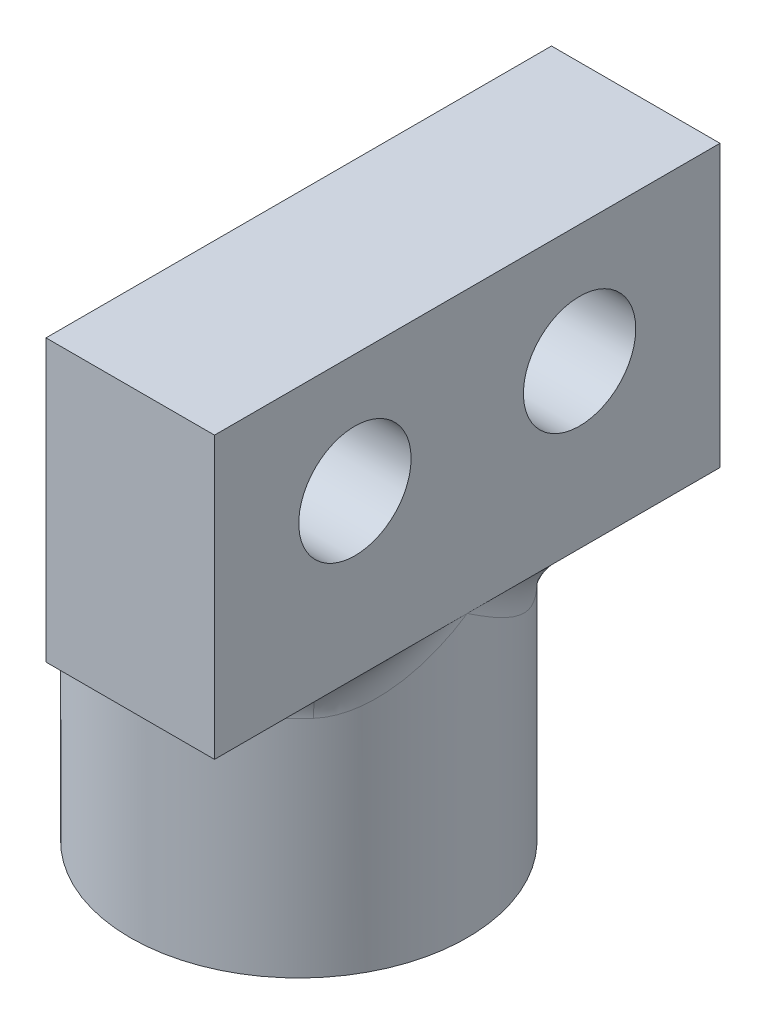
ISO-10303-21;
HEADER;
FILE_DESCRIPTION(('STEP AP214'),'2;1');
FILE_NAME('part.step','',(''),(''),'','','');
FILE_SCHEMA(('AUTOMOTIVE_DESIGN { 1 0 10303 214 1 1 1 1 }'));
ENDSEC;
DATA;
#1=APPLICATION_CONTEXT('core data for automotive mechanical design processes');
#2=APPLICATION_PROTOCOL_DEFINITION('international standard','automotive_design',2000,#1);
#3=PRODUCT_CONTEXT('',#1,'mechanical');
#4=PRODUCT('Part','Part','',(#3));
#5=PRODUCT_RELATED_PRODUCT_CATEGORY('part','',(#4));
#6=PRODUCT_DEFINITION_FORMATION('','',#4);
#7=PRODUCT_DEFINITION_CONTEXT('part definition',#1,'design');
#8=PRODUCT_DEFINITION('design','',#6,#7);
#9=PRODUCT_DEFINITION_SHAPE('','',#8);
#10=(LENGTH_UNIT() NAMED_UNIT(*) SI_UNIT(.MILLI.,.METRE.));
#11=(NAMED_UNIT(*) PLANE_ANGLE_UNIT() SI_UNIT($,.RADIAN.));
#12=(NAMED_UNIT(*) SI_UNIT($,.STERADIAN.) SOLID_ANGLE_UNIT());
#13=UNCERTAINTY_MEASURE_WITH_UNIT(LENGTH_MEASURE(1.E-05),#10,'distance_accuracy_value','');
#14=(GEOMETRIC_REPRESENTATION_CONTEXT(3) GLOBAL_UNCERTAINTY_ASSIGNED_CONTEXT((#13)) GLOBAL_UNIT_ASSIGNED_CONTEXT((#10,
#11,#12)) REPRESENTATION_CONTEXT('',''));
#15=CARTESIAN_POINT('',(0.,0.,0.));
#16=DIRECTION('',(0.,0.,1.));
#17=DIRECTION('',(1.,0.,0.));
#18=AXIS2_PLACEMENT_3D('',#15,#16,#17);
#19=CARTESIAN_POINT('',(0.,10.,0.));
#20=DIRECTION('',(0.,-1.,0.));
#21=DIRECTION('',(0.,0.,-1.));
#22=AXIS2_PLACEMENT_3D('',#19,#20,#21);
#23=CYLINDRICAL_SURFACE('',#22,4.);
#24=CARTESIAN_POINT('',(0.,0.,0.));
#25=DIRECTION('',(0.,1.,0.));
#26=DIRECTION('',(0.,0.,1.));
#27=AXIS2_PLACEMENT_3D('',#24,#25,#26);
#28=CIRCLE('',#27,4.);
#29=CARTESIAN_POINT('',(0.,0.,4.));
#30=VERTEX_POINT('',#29);
#31=EDGE_CURVE('E146',#30,#30,#28,.T.);
#32=ORIENTED_EDGE('',*,*,#31,.F.);
#33=EDGE_LOOP('',(#32));
#34=FACE_BOUND('',#33,.T.);
#35=CARTESIAN_POINT('',(0.,7.,0.));
#36=DIRECTION('',(0.,1.,0.));
#37=DIRECTION('',(0.,0.,1.));
#38=AXIS2_PLACEMENT_3D('',#35,#36,#37);
#39=CIRCLE('',#38,4.);
#40=CARTESIAN_POINT('',(0.,7.,4.));
#41=VERTEX_POINT('',#40);
#42=EDGE_CURVE('E231',#41,#41,#39,.T.);
#43=ORIENTED_EDGE('',*,*,#42,.T.);
#44=EDGE_LOOP('',(#43));
#45=FACE_BOUND('',#44,.T.);
#46=ADVANCED_FACE('F37',(#34,#45),#23,.F.);
#47=CARTESIAN_POINT('',(0.,10.,0.));
#48=DIRECTION('',(0.,1.,0.));
#49=DIRECTION('',(0.,0.,1.));
#50=AXIS2_PLACEMENT_3D('',#47,#48,#49);
#51=PLANE('',#50);
#52=CARTESIAN_POINT('',(0.,10.,0.));
#53=DIRECTION('',(0.,1.,0.));
#54=DIRECTION('',(0.,0.,1.));
#55=AXIS2_PLACEMENT_3D('',#52,#53,#54);
#56=CIRCLE('',#55,6.);
#57=CARTESIAN_POINT('',(-1.,10.,-5.91607978309962));
#58=VERTEX_POINT('',#57);
#59=CARTESIAN_POINT('',(-1.,10.,5.91607978309962));
#60=VERTEX_POINT('',#59);
#61=EDGE_CURVE('E155',#58,#60,#56,.T.);
#62=ORIENTED_EDGE('',*,*,#61,.T.);
#63=DIRECTION('',(0.,0.,-1.));
#64=VECTOR('',#63,1.);
#65=CARTESIAN_POINT('',(-1.,10.,-6.));
#66=LINE('',#65,#64);
#67=EDGE_CURVE('E278',#60,#58,#66,.T.);
#68=ORIENTED_EDGE('',*,*,#67,.T.);
#69=EDGE_LOOP('',(#62,#68));
#70=FACE_BOUND('',#69,.T.);
#71=ADVANCED_FACE('F324',(#70),#51,.T.);
#72=CARTESIAN_POINT('',(0.,0.,0.));
#73=DIRECTION('',(0.,1.,0.));
#74=DIRECTION('',(0.,0.,1.));
#75=AXIS2_PLACEMENT_3D('',#72,#73,#74);
#76=PLANE('',#75);
#77=CARTESIAN_POINT('',(0.,0.,0.));
#78=DIRECTION('',(0.,1.,0.));
#79=DIRECTION('',(0.,0.,1.));
#80=AXIS2_PLACEMENT_3D('',#77,#78,#79);
#81=CIRCLE('',#80,6.);
#82=CARTESIAN_POINT('',(0.,0.,6.));
#83=VERTEX_POINT('',#82);
#84=EDGE_CURVE('E149',#83,#83,#81,.T.);
#85=ORIENTED_EDGE('',*,*,#84,.F.);
#86=EDGE_LOOP('',(#85));
#87=FACE_BOUND('',#86,.T.);
#88=ORIENTED_EDGE('',*,*,#31,.T.);
#89=EDGE_LOOP('',(#88));
#90=FACE_BOUND('',#89,.T.);
#91=ADVANCED_FACE('F187',(#87,#90),#76,.F.);
#92=CARTESIAN_POINT('',(0.,10.,0.));
#93=DIRECTION('',(0.,-1.,0.));
#94=DIRECTION('',(0.,0.,-1.));
#95=AXIS2_PLACEMENT_3D('',#92,#93,#94);
#96=CYLINDRICAL_SURFACE('',#95,6.);
#97=ORIENTED_EDGE('',*,*,#61,.F.);
#98=CARTESIAN_POINT('',(-1.,10.,-5.91607978309962));
#99=CARTESIAN_POINT('',(-0.972295685701405,10.0000001747414,-5.92076372818397));
#100=CARTESIAN_POINT('',(-0.944570209980479,10.0011521080634,-5.92524870131366));
#101=CARTESIAN_POINT('',(-0.889246515655249,10.0057640704647,-5.93380337786455));
#102=CARTESIAN_POINT('',(-0.861648302356349,10.0092241949091,-5.93787306411977));
#103=CARTESIAN_POINT('',(-0.779382785868549,10.0230600602079,-5.94942135947803));
#104=CARTESIAN_POINT('',(-0.725162463681373,10.036891276915,-5.95625302477123));
#105=CARTESIAN_POINT('',(-0.619594288141451,10.0734906939978,-5.96816013882162));
#106=CARTESIAN_POINT('',(-0.568249114498119,10.0962670781436,-5.97323397134652));
#107=CARTESIAN_POINT('',(-0.470001447300006,10.1501542895213,-5.98176648013792));
#108=CARTESIAN_POINT('',(-0.423097543931658,10.1812624598685,-5.9852256703274));
#109=CARTESIAN_POINT('',(-0.33543960373115,10.2506909420177,-5.99077622626737));
#110=CARTESIAN_POINT('',(-0.294643628615312,10.2889575867555,-5.99287728287855));
#111=CARTESIAN_POINT('',(-0.219966264969299,10.3717828298557,-5.99608333344492));
#112=CARTESIAN_POINT('',(-0.186086604709587,10.4163429961682,-5.99718807867384));
#113=CARTESIAN_POINT('',(-0.126123868965448,10.5106395037474,-5.99874976095427));
#114=CARTESIAN_POINT('',(-0.100066342528996,10.5603921068612,-5.99920459302881));
#115=CARTESIAN_POINT('',(-0.0566416255269108,10.6635444366849,-5.99977213876146));
#116=CARTESIAN_POINT('',(-0.0392699367541451,10.7169422592958,-5.99988502965703));
#117=CARTESIAN_POINT('',(-0.0176857584929651,10.8088414953916,-5.99998044190027));
#118=CARTESIAN_POINT('',(-0.0110587993800629,10.8467939872846,-5.99999264488213));
#119=CARTESIAN_POINT('',(-0.00221563612105374,10.9231592194416,-6.00000001457346));
#120=CARTESIAN_POINT('',(6.29037270521335E-06,10.9615712972982,-5.99999520340778));
#121=CARTESIAN_POINT('',(0.,11.,-6.));
#122=B_SPLINE_CURVE_WITH_KNOTS('',3,(#98,#99,#100,#101,#102,#103,#104,#105,#106,#107,#108,#109,
#110,#111,#112,#113,#114,#115,#116,#117,#118,#119,#120,#121),.UNSPECIFIED.,.F.,.F.,(4,2,2,2,2,2,
2,2,2,2,2,4),(0.,0.0842429978800039,0.16848947655248,0.336735693421336,0.505136195593484,
0.673483061116316,0.840615038340064,1.00778872804346,1.1755026518886,1.34312963013154,
1.45846933488263,1.5736591094174),.UNSPECIFIED.);
#123=CARTESIAN_POINT('',(0.,11.,-6.));
#124=VERTEX_POINT('',#123);
#125=EDGE_CURVE('E47',#58,#124,#122,.T.);
#126=ORIENTED_EDGE('',*,*,#125,.T.);
#127=DIRECTION('',(0.,-1.,0.));
#128=VECTOR('',#127,1.);
#129=CARTESIAN_POINT('',(0.,10.,-6.));
#130=LINE('',#129,#128);
#131=CARTESIAN_POINT('',(0.,8.,-6.));
#132=VERTEX_POINT('',#131);
#133=EDGE_CURVE('E55',#124,#132,#130,.T.);
#134=ORIENTED_EDGE('',*,*,#133,.T.);
#135=CARTESIAN_POINT('',(0.,8.,0.));
#136=DIRECTION('',(0.,1.,0.));
#137=DIRECTION('',(0.,0.,1.));
#138=AXIS2_PLACEMENT_3D('',#135,#136,#137);
#139=CIRCLE('',#138,6.);
#140=CARTESIAN_POINT('',(4.5,8.,-3.96862696659689));
#141=VERTEX_POINT('',#140);
#142=EDGE_CURVE('E274',#132,#141,#139,.F.);
#143=ORIENTED_EDGE('',*,*,#142,.T.);
#144=CARTESIAN_POINT('',(3.8881741324276,8.1739324058906,-4.56969385363187));
#145=CARTESIAN_POINT('',(4.53137954969786,10.6560837682309,-4.02241547014019));
#146=CARTESIAN_POINT('',(6.,10.,-6.09292513817582));
#147=CARTESIAN_POINT('',(3.93526279049348,8.14589332069388,-4.52964079914924));
#148=CARTESIAN_POINT('',(4.50293319784637,10.6088499220202,-4.03529777543976));
#149=CARTESIAN_POINT('',(6.,10.,-6.0395210655389));
#150=CARTESIAN_POINT('',(3.9824101299893,8.12168251324196,-4.48825723590215));
#151=CARTESIAN_POINT('',(4.48121743740939,10.5586274207049,-4.04464880001376));
#152=CARTESIAN_POINT('',(6.,10.,-5.98434298121036));
#153=CARTESIAN_POINT('',(4.07624021718959,8.08033888259881,-4.40320803649471));
#154=CARTESIAN_POINT('',(4.45084982766612,10.4565617555743,-4.05540477376931));
#155=CARTESIAN_POINT('',(6.,10.,-5.87094404866471));
#156=CARTESIAN_POINT('',(4.12292364060194,8.06319358164838,-4.35954657813812));
#157=CARTESIAN_POINT('',(4.44188962597711,10.4048045270733,-4.05700075307973));
#158=CARTESIAN_POINT('',(6.,10.,-5.81272877085263));
#159=CARTESIAN_POINT('',(4.26070395863014,8.0216524084973,-4.22641488674984));
#160=CARTESIAN_POINT('',(4.4322656458812,10.2541454503889,-4.04984181529547));
#161=CARTESIAN_POINT('',(6.,10.,-5.6352198489962));
#162=CARTESIAN_POINT('',(4.35052291834169,8.00659961985399,-4.1339578129278));
#163=CARTESIAN_POINT('',(4.44662522066588,10.155274627041,-4.03031422433822));
#164=CARTESIAN_POINT('',(6.,10.,-5.51194375056902));
#165=CARTESIAN_POINT('',(4.5639049110967,7.99466967262371,-3.89950006231645));
#166=CARTESIAN_POINT('',(4.51755070316198,9.93712657404065,-3.94773896778231));
#167=CARTESIAN_POINT('',(6.,10.,-5.19933341642394));
#168=CARTESIAN_POINT('',(4.68409952624939,8.00926290050841,-3.75418985202283));
#169=CARTESIAN_POINT('',(4.58834624431363,9.82393029766119,-3.87068436475619));
#170=CARTESIAN_POINT('',(6.,10.,-5.00558646936602));
#171=CARTESIAN_POINT('',(4.90920863029963,8.06974267671834,-3.45472418962107));
#172=CARTESIAN_POINT('',(4.75389126884018,9.64567469576468,-3.67175567550996));
#173=CARTESIAN_POINT('',(6.,10.,-4.60629891949251));
#174=CARTESIAN_POINT('',(5.01402699051333,8.1158166846134,-3.30052084588875));
#175=CARTESIAN_POINT('',(4.84797666678286,9.57787138352697,-3.55142984401783));
#176=CARTESIAN_POINT('',(6.,10.,-4.400694461178));
#177=CARTESIAN_POINT('',(5.18467181766214,8.21721867742286,-3.02311379553071));
#178=CARTESIAN_POINT('',(5.01588274789588,9.49417298513019,-3.31155428787133));
#179=CARTESIAN_POINT('',(6.,10.,-4.03081839404632));
#180=CARTESIAN_POINT('',(5.25390663476926,8.26793252542353,-2.90100125326329));
#181=CARTESIAN_POINT('',(5.08895909271457,9.46911888364102,-3.19949052276703));
#182=CARTESIAN_POINT('',(6.,10.,-3.86800167103543));
#183=CARTESIAN_POINT('',(5.38272131376337,8.37973522821349,-2.65436965159966));
#184=CARTESIAN_POINT('',(5.23033235010697,9.43865198178121,-2.96296529866294));
#185=CARTESIAN_POINT('',(6.,10.,-3.53915953548441));
#186=CARTESIAN_POINT('',(5.44229764357389,8.44082786183934,-2.52984973038109));
#187=CARTESIAN_POINT('',(5.29903513805874,9.43262251721526,-2.8384046710416));
#188=CARTESIAN_POINT('',(6.,10.,-3.3731329738478));
#189=CARTESIAN_POINT('',(5.60686792650618,8.63605363037383,-2.15359667028571));
#190=CARTESIAN_POINT('',(5.49059794596169,9.43799544623112,-2.45601357152588));
#191=CARTESIAN_POINT('',(6.,10.,-2.87146222703491));
#192=CARTESIAN_POINT('',(5.69774526915183,8.78216268317035,-1.89910069151801));
#193=CARTESIAN_POINT('',(5.60620492387143,9.4708889782354,-2.1783557115166));
#194=CARTESIAN_POINT('',(6.,10.,-2.53213425535389));
#195=CARTESIAN_POINT('',(5.8473807588486,9.10023601796244,-1.37355257644114));
#196=CARTESIAN_POINT('',(5.79687944872776,9.57575225163142,-1.59397739451812));
#197=CARTESIAN_POINT('',(6.,10.,-1.83140343525849));
#198=CARTESIAN_POINT('',(5.90428472504987,9.27313348230999,-1.10231347151144));
#199=CARTESIAN_POINT('',(5.87285110918309,9.64928669055712,-1.28181943176351));
#200=CARTESIAN_POINT('',(6.,10.,-1.46975129534949));
#201=CARTESIAN_POINT('',(5.98030661422106,9.62807296341012,-0.557954224252146));
#202=CARTESIAN_POINT('',(5.97322691829025,9.81343349237779,-0.65341591032027));
#203=CARTESIAN_POINT('',(6.,10.,-0.743938965668618));
#204=CARTESIAN_POINT('',(5.99944262915574,9.8101105588937,-0.284835045485269));
#205=CARTESIAN_POINT('',(5.99925080771343,9.90504661042241,-0.332343061915692));
#206=CARTESIAN_POINT('',(6.,10.,-0.379780060647023));
#207=CARTESIAN_POINT('',(5.99999599572093,9.99466670941827,-0.00799993980455591));
#208=CARTESIAN_POINT('',(5.99999474816089,9.99733334824275,-0.00933327087008581));
#209=CARTESIAN_POINT('',(6.,10.,-0.010666586406075));
#210=CARTESIAN_POINT('',(5.9999999954381,9.99733337812888,-0.00399993733404565));
#211=CARTESIAN_POINT('',(6.00000008372391,9.99866668474011,-0.00466659350034427));
#212=CARTESIAN_POINT('',(6.,10.,-0.00533324977872788));
#213=CARTESIAN_POINT('',(6.,10.,0.));
#214=CARTESIAN_POINT('',(6.,10.,0.));
#215=CARTESIAN_POINT('',(6.,10.,0.));
#216=(BOUNDED_SURFACE() B_SPLINE_SURFACE(3,2,((#144,#145,#146),(#147,#148,#149),(#150,#151,
#152),(#153,#154,#155),(#156,#157,#158),(#159,#160,#161),(#162,#163,#164),(#165,#166,#167),
(#168,#169,#170),(#171,#172,#173),(#174,#175,#176),(#177,#178,#179),(#180,#181,#182),(#183,#184,
#185),(#186,#187,#188),(#189,#190,#191),(#192,#193,#194),(#195,#196,#197),(#198,#199,#200),
(#201,#202,#203),(#204,#205,#206),(#207,#208,#209),(#210,#211,#212),(#213,#214,#215)),
.UNSPECIFIED.,.F.,.F.,.F.) B_SPLINE_SURFACE_WITH_KNOTS((4,2,2,2,2,2,2,2,2,2,2,4),(3,3),(0.,
0.26095127997421,0.521439721635325,1.03703177445814,1.78857808075952,2.5446390990503,
3.12560695240519,3.70678678683636,4.86881450148977,6.08953591362392,7.30967242206215,
7.32756097306819),(0.,1.),
.UNSPECIFIED.) GEOMETRIC_REPRESENTATION_ITEM() RATIONAL_B_SPLINE_SURFACE(((1.,0.606497892647934,
1.),(1.,0.61356239369123,1.),(1.,0.62082000262735,1.),(1.,0.635585634771414,1.),(1.,
0.643093190998653,1.),(1.,0.665670024822543,1.),(1.,0.680944336214346,1.),(1.,0.718190766945489,
1.),(1.,0.74002912360749,1.),(1.,0.781881004562588,1.),(1.,0.801882778589946,1.),(1.,
0.83493307659474,1.),(1.,0.84851913923067,1.),(1.,0.874014565928818,1.),(1.,0.88592331639563,
1.),(1.,0.91901863083676,1.),(1.,0.937582558643049,1.),(1.,0.968311867041381,1.),(1.,
0.980106697900777,1.),(1.,0.99589078916237,1.),(1.,0.999883786864014,1.),(1.,0.999999167156847,
1.),(1.,1.00000000047256,1.),(1.,1.,1.))) REPRESENTATION_ITEM('') SURFACE());
#217=CARTESIAN_POINT('',(3.8881741324276,8.1739324058906,-4.56969385363187));
#218=CARTESIAN_POINT('',(3.93526279049348,8.14589332069388,-4.52964079914924));
#219=CARTESIAN_POINT('',(3.9824101299893,8.12168251324196,-4.48825723590215));
#220=CARTESIAN_POINT('',(4.07624021718959,8.08033888259881,-4.40320803649471));
#221=CARTESIAN_POINT('',(4.12292364060194,8.06319358164838,-4.35954657813812));
#222=CARTESIAN_POINT('',(4.26070395863014,8.0216524084973,-4.22641488674984));
#223=CARTESIAN_POINT('',(4.35052291834169,8.00659961985399,-4.1339578129278));
#224=CARTESIAN_POINT('',(4.56390491109669,7.99466967262371,-3.89950006231645));
#225=CARTESIAN_POINT('',(4.68409952624939,8.00926290050841,-3.75418985202283));
#226=CARTESIAN_POINT('',(4.90920863029964,8.06974267671834,-3.45472418962107));
#227=CARTESIAN_POINT('',(5.01402699051333,8.1158166846134,-3.30052084588875));
#228=CARTESIAN_POINT('',(5.18467181766214,8.21721867742286,-3.02311379553071));
#229=CARTESIAN_POINT('',(5.25390663476926,8.26793252542353,-2.90100125326329));
#230=CARTESIAN_POINT('',(5.38272131376337,8.3797352282135,-2.65436965159966));
#231=CARTESIAN_POINT('',(5.44229764357389,8.44082786183934,-2.52984973038109));
#232=CARTESIAN_POINT('',(5.60686792650618,8.63605363037383,-2.15359667028571));
#233=CARTESIAN_POINT('',(5.69774526915183,8.78216268317035,-1.89910069151801));
#234=CARTESIAN_POINT('',(5.8473807588486,9.10023601796244,-1.37355257644114));
#235=CARTESIAN_POINT('',(5.90428472504987,9.27313348230998,-1.10231347151144));
#236=CARTESIAN_POINT('',(5.98030661422106,9.62807296341012,-0.557954224252145));
#237=CARTESIAN_POINT('',(5.99944262915573,9.81011055889371,-0.284835045485267));
#238=CARTESIAN_POINT('',(5.99999599572093,9.99466670941827,-0.0079999398045559));
#239=CARTESIAN_POINT('',(5.9999999954381,9.99733337812888,-0.00399993733404564));
#240=CARTESIAN_POINT('',(6.,10.,0.));
#241=B_SPLINE_CURVE_WITH_KNOTS('',3,(#217,#218,#219,#220,#221,#222,#223,#224,#225,#226,#227,
#228,#229,#230,#231,#232,#233,#234,#235,#236,#237,#238,#239,#240),.UNSPECIFIED.,.F.,.F.,(4,2,2,
2,2,2,2,2,2,2,2,4),(0.,0.26095127997421,0.521439721635325,1.03703177445814,1.78857808075952,
2.5446390990503,3.12560695240519,3.70678678683636,4.86881450148977,6.08953591362392,
7.30967242206215,7.32756097306819),.UNSPECIFIED.);
#242=CARTESIAN_POINT('',(6.,10.,0.));
#243=VERTEX_POINT('',#242);
#244=EDGE_CURVE('E173',#141,#243,#241,.T.);
#245=ORIENTED_EDGE('',*,*,#244,.T.);
#246=CARTESIAN_POINT('',(6.,10.,6.09292513817593));
#247=CARTESIAN_POINT('',(4.53137954969792,10.656083768231,4.02241547014016));
#248=CARTESIAN_POINT('',(3.88817413242751,8.17393240589066,4.56969385363195));
#249=CARTESIAN_POINT('',(6.,10.,6.03952106553902));
#250=CARTESIAN_POINT('',(4.50293319784642,10.6088499220203,4.03529777543974));
#251=CARTESIAN_POINT('',(3.93526279049338,8.14589332069393,4.52964079914932));
#252=CARTESIAN_POINT('',(6.,10.,5.98434298121048));
#253=CARTESIAN_POINT('',(4.48121743740943,10.558627420705,4.04464880001374));
#254=CARTESIAN_POINT('',(3.9824101299892,8.12168251324201,4.48825723590224));
#255=CARTESIAN_POINT('',(6.,10.,5.87094404866483));
#256=CARTESIAN_POINT('',(4.45084982766614,10.4565617555745,4.05540477376931));
#257=CARTESIAN_POINT('',(4.07624021718949,8.08033888259885,4.4032080364948));
#258=CARTESIAN_POINT('',(6.,10.,5.81272877085276));
#259=CARTESIAN_POINT('',(4.44188962597712,10.4048045270734,4.05700075307973));
#260=CARTESIAN_POINT('',(4.12292364060184,8.06319358164841,4.35954657813821));
#261=CARTESIAN_POINT('',(6.,10.,5.63521984899635));
#262=CARTESIAN_POINT('',(4.43226564588119,10.2541454503891,4.04984181529549));
#263=CARTESIAN_POINT('',(4.26070395863002,8.02165240849732,4.22641488674995));
#264=CARTESIAN_POINT('',(6.,10.,5.51194375056919));
#265=CARTESIAN_POINT('',(4.44662522066586,10.1552746270411,4.03031422433825));
#266=CARTESIAN_POINT('',(4.35052291834157,8.00659961985401,4.13395781292792));
#267=CARTESIAN_POINT('',(6.,10.,5.19933341642414));
#268=CARTESIAN_POINT('',(4.51755070316191,9.93712657404078,3.94773896778238));
#269=CARTESIAN_POINT('',(4.56390491109656,7.99466967262371,3.8995000623166));
#270=CARTESIAN_POINT('',(6.,10.,5.00558646936625));
#271=CARTESIAN_POINT('',(4.58834624431354,9.82393029766132,3.87068436475629));
#272=CARTESIAN_POINT('',(4.68409952624925,8.00926290050838,3.75418985202301));
#273=CARTESIAN_POINT('',(6.,10.,4.60629891949278));
#274=CARTESIAN_POINT('',(4.75389126884006,9.64567469576478,3.67175567551012));
#275=CARTESIAN_POINT('',(4.90920863029949,8.06974267671829,3.45472418962128));
#276=CARTESIAN_POINT('',(6.,10.,4.40069446117829));
#277=CARTESIAN_POINT('',(4.84797666678273,9.57787138352706,3.55142984401801));
#278=CARTESIAN_POINT('',(5.01402699051319,8.11581668461333,3.30052084588897));
#279=CARTESIAN_POINT('',(6.,10.,4.03081839404665));
#280=CARTESIAN_POINT('',(5.01588274789573,9.49417298513024,3.31155428787155));
#281=CARTESIAN_POINT('',(5.184671817662,8.21721867742276,3.02311379553095));
#282=CARTESIAN_POINT('',(6.,10.,3.86800167103577));
#283=CARTESIAN_POINT('',(5.08895909271442,9.46911888364106,3.19949052276727));
#284=CARTESIAN_POINT('',(5.25390663476912,8.26793252542342,2.90100125326355));
#285=CARTESIAN_POINT('',(6.,10.,3.53915953548477));
#286=CARTESIAN_POINT('',(5.23033235010682,9.43865198178123,2.9629652986632));
#287=CARTESIAN_POINT('',(5.38272131376324,8.37973522821336,2.65436965159993));
#288=CARTESIAN_POINT('',(6.,10.,3.37313297384817));
#289=CARTESIAN_POINT('',(5.29903513805859,9.43262251721526,2.83840467104188));
#290=CARTESIAN_POINT('',(5.44229764357376,8.44082786183919,2.52984973038136));
#291=CARTESIAN_POINT('',(6.,10.,2.87146222703534));
#292=CARTESIAN_POINT('',(5.49059794596154,9.4379954462311,2.45601357152622));
#293=CARTESIAN_POINT('',(5.60686792650605,8.63605363037368,2.15359667028603));
#294=CARTESIAN_POINT('',(6.,10.,2.5321342553544));
#295=CARTESIAN_POINT('',(5.60620492387128,9.47088897823539,2.17835571151702));
#296=CARTESIAN_POINT('',(5.69774526915172,8.78216268317025,1.8991006915184));
#297=CARTESIAN_POINT('',(6.,10.,1.83140343525887));
#298=CARTESIAN_POINT('',(5.79687944872767,9.57575225163129,1.59397739451844));
#299=CARTESIAN_POINT('',(5.84738075884853,9.10023601796214,1.37355257644142));
#300=CARTESIAN_POINT('',(6.,10.,1.46975129534964));
#301=CARTESIAN_POINT('',(5.87285110918304,9.64928669055686,1.28181943176364));
#302=CARTESIAN_POINT('',(5.90428472504982,9.27313348230943,1.10231347151155));
#303=CARTESIAN_POINT('',(6.,10.,0.743938965668995));
#304=CARTESIAN_POINT('',(5.97322691829023,9.81343349237794,0.653415910320603));
#305=CARTESIAN_POINT('',(5.98030661422105,9.62807296341042,0.55795422425243));
#306=CARTESIAN_POINT('',(6.,10.,0.37978006064785));
#307=CARTESIAN_POINT('',(5.99925080771341,9.90504661042309,0.332343061916416));
#308=CARTESIAN_POINT('',(5.99944262915574,9.8101105588951,0.284835045485892));
#309=CARTESIAN_POINT('',(6.,10.,0.010666586406095));
#310=CARTESIAN_POINT('',(5.99999474816089,9.99733334824277,0.00933327087010328));
#311=CARTESIAN_POINT('',(5.99999599572093,9.99466670941831,0.00799993980457092));
#312=CARTESIAN_POINT('',(6.,10.,0.00533324977873798));
#313=CARTESIAN_POINT('',(6.00000008372391,9.99866668474012,0.00466659350035312));
#314=CARTESIAN_POINT('',(5.9999999954381,9.99733337812891,0.00399993733405325));
#315=CARTESIAN_POINT('',(6.,10.,0.));
#316=CARTESIAN_POINT('',(6.,10.,0.));
#317=CARTESIAN_POINT('',(6.,10.,0.));
#318=(BOUNDED_SURFACE() B_SPLINE_SURFACE(3,2,((#246,#247,#248),(#249,#250,#251),(#252,#253,
#254),(#255,#256,#257),(#258,#259,#260),(#261,#262,#263),(#264,#265,#266),(#267,#268,#269),
(#270,#271,#272),(#273,#274,#275),(#276,#277,#278),(#279,#280,#281),(#282,#283,#284),(#285,#286,
#287),(#288,#289,#290),(#291,#292,#293),(#294,#295,#296),(#297,#298,#299),(#300,#301,#302),
(#303,#304,#305),(#306,#307,#308),(#309,#310,#311),(#312,#313,#314),(#315,#316,#317)),
.UNSPECIFIED.,.F.,.F.,.F.) B_SPLINE_SURFACE_WITH_KNOTS((4,2,2,2,2,2,2,2,2,2,2,4),(3,3),(0.,
0.260951279974199,0.521439721635305,1.03703177445807,1.78857808075937,2.5446390990501,
3.12560695240495,3.7067867868361,4.86881450148938,6.08953591362379,7.30967242206233,
7.32756097306836),(0.,1.),
.UNSPECIFIED.) GEOMETRIC_REPRESENTATION_ITEM() RATIONAL_B_SPLINE_SURFACE(((1.,0.606497892647919,
1.),(1.,0.613562393691215,1.),(1.,0.620820002627334,1.),(1.,0.635585634771398,1.),(1.,
0.643093190998636,1.),(1.,0.665670024822524,1.),(1.,0.680944336214326,1.),(1.,0.718190766945465,
1.),(1.,0.740029123607464,1.),(1.,0.78188100456256,1.),(1.,0.801882778589918,1.),(1.,
0.834933076594713,1.),(1.,0.848519139230642,1.),(1.,0.874014565928791,1.),(1.,0.885923316395604,
1.),(1.,0.919018630836735,1.),(1.,0.937582558643025,1.),(1.,0.968311867041365,1.),(1.,
0.980106697900766,1.),(1.,0.995890789162369,1.),(1.,0.999883786864016,1.),(1.,0.999999167156847,
1.),(1.,1.00000000047256,1.),(1.,1.,1.))) REPRESENTATION_ITEM('') SURFACE());
#319=CARTESIAN_POINT('',(3.88817413242751,8.17393240589066,4.56969385363195));
#320=CARTESIAN_POINT('',(3.93526279049338,8.14589332069393,4.52964079914932));
#321=CARTESIAN_POINT('',(3.9824101299892,8.12168251324201,4.48825723590224));
#322=CARTESIAN_POINT('',(4.07624021718949,8.08033888259885,4.4032080364948));
#323=CARTESIAN_POINT('',(4.12292364060184,8.06319358164841,4.35954657813821));
#324=CARTESIAN_POINT('',(4.26070395863002,8.02165240849732,4.22641488674995));
#325=CARTESIAN_POINT('',(4.35052291834157,8.00659961985401,4.13395781292792));
#326=CARTESIAN_POINT('',(4.56390491109656,7.99466967262371,3.8995000623166));
#327=CARTESIAN_POINT('',(4.68409952624925,8.00926290050838,3.75418985202301));
#328=CARTESIAN_POINT('',(4.90920863029949,8.06974267671829,3.45472418962128));
#329=CARTESIAN_POINT('',(5.01402699051319,8.11581668461333,3.30052084588897));
#330=CARTESIAN_POINT('',(5.184671817662,8.21721867742276,3.02311379553095));
#331=CARTESIAN_POINT('',(5.25390663476912,8.26793252542342,2.90100125326355));
#332=CARTESIAN_POINT('',(5.38272131376324,8.37973522821336,2.65436965159993));
#333=CARTESIAN_POINT('',(5.44229764357376,8.44082786183919,2.52984973038136));
#334=CARTESIAN_POINT('',(5.60686792650605,8.63605363037368,2.15359667028603));
#335=CARTESIAN_POINT('',(5.69774526915171,8.78216268317025,1.8991006915184));
#336=CARTESIAN_POINT('',(5.84738075884853,9.10023601796214,1.37355257644142));
#337=CARTESIAN_POINT('',(5.90428472504982,9.27313348230943,1.10231347151155));
#338=CARTESIAN_POINT('',(5.98030661422105,9.62807296341042,0.557954224252429));
#339=CARTESIAN_POINT('',(5.99944262915573,9.81011055889512,0.284835045485888));
#340=CARTESIAN_POINT('',(5.99999599572093,9.99466670941831,0.00799993980457092));
#341=CARTESIAN_POINT('',(5.9999999954381,9.99733337812891,0.00399993733405325));
#342=CARTESIAN_POINT('',(6.,10.,0.));
#343=B_SPLINE_CURVE_WITH_KNOTS('',3,(#319,#320,#321,#322,#323,#324,#325,#326,#327,#328,#329,
#330,#331,#332,#333,#334,#335,#336,#337,#338,#339,#340,#341,#342),.UNSPECIFIED.,.F.,.F.,(4,2,2,
2,2,2,2,2,2,2,2,4),(0.,0.260951279974199,0.521439721635305,1.03703177445807,1.78857808075937,
2.5446390990501,3.12560695240495,3.7067867868361,4.86881450148938,6.08953591362379,
7.30967242206233,7.32756097306836),.UNSPECIFIED.);
#344=CARTESIAN_POINT('',(4.5,8.,3.96862696659689));
#345=VERTEX_POINT('',#344);
#346=EDGE_CURVE('E165',#243,#345,#343,.F.);
#347=ORIENTED_EDGE('',*,*,#346,.T.);
#348=CARTESIAN_POINT('',(0.,8.,0.));
#349=DIRECTION('',(0.,1.,0.));
#350=DIRECTION('',(0.,0.,1.));
#351=AXIS2_PLACEMENT_3D('',#348,#349,#350);
#352=CIRCLE('',#351,6.);
#353=CARTESIAN_POINT('',(0.,8.,6.));
#354=VERTEX_POINT('',#353);
#355=EDGE_CURVE('E163',#345,#354,#352,.F.);
#356=ORIENTED_EDGE('',*,*,#355,.T.);
#357=DIRECTION('',(0.,-1.,0.));
#358=VECTOR('',#357,1.);
#359=CARTESIAN_POINT('',(0.,8.,6.));
#360=LINE('',#359,#358);
#361=CARTESIAN_POINT('',(0.,11.,6.));
#362=VERTEX_POINT('',#361);
#363=EDGE_CURVE('E62',#354,#362,#360,.F.);
#364=ORIENTED_EDGE('',*,*,#363,.T.);
#365=CARTESIAN_POINT('',(0.,11.,6.));
#366=CARTESIAN_POINT('',(-1.88089017930812E-07,10.9718729792982,5.99999886122672));
#367=CARTESIAN_POINT('',(-0.0011874383318849,10.943759431412,6.00000012803914));
#368=CARTESIAN_POINT('',(-0.00592387337367543,10.887733369955,5.99999776490726));
#369=CARTESIAN_POINT('',(-0.00947294764025325,10.8598208470381,5.99999413519211));
#370=CARTESIAN_POINT('',(-0.0236296646297392,10.7767307472723,5.9999613765877));
#371=CARTESIAN_POINT('',(-0.0377468918911326,10.7221094743238,5.99991043668177));
#372=CARTESIAN_POINT('',(-0.0749487969452187,10.616012559446,5.99956037155049));
#373=CARTESIAN_POINT('',(-0.0980379158203864,10.5645384900082,5.99926112332922));
#374=CARTESIAN_POINT('',(-0.152523802739845,10.466201121742,5.99812270924806));
#375=CARTESIAN_POINT('',(-0.183919142204433,10.4193370319469,5.99728363619668));
#376=CARTESIAN_POINT('',(-0.254074204833553,10.3316092387276,5.99472044312221));
#377=CARTESIAN_POINT('',(-0.292825270989832,10.2907385808235,5.99299735947866));
#378=CARTESIAN_POINT('',(-0.376592406669062,10.2160934167901,5.98831642375389));
#379=CARTESIAN_POINT('',(-0.421608973130594,10.1823194740596,5.98535847369388));
#380=CARTESIAN_POINT('',(-0.516341409191449,10.1229679643103,5.97792908244285));
#381=CARTESIAN_POINT('',(-0.56603429041555,10.0973527631093,5.9734647920856));
#382=CARTESIAN_POINT('',(-0.668827353596947,10.0547935362701,5.96282930347378));
#383=CARTESIAN_POINT('',(-0.72192618300808,10.0378460922527,5.95665877960296));
#384=CARTESIAN_POINT('',(-0.81277206590798,10.0169544533057,5.94481162470669));
#385=CARTESIAN_POINT('',(-0.850043263263915,10.0105904588611,5.93959971610509));
#386=CARTESIAN_POINT('',(-0.92489327328535,10.0021132789893,5.9284077092154));
#387=CARTESIAN_POINT('',(-0.962471527429099,9.99999359847904,5.92242879961497));
#388=CARTESIAN_POINT('',(-1.,10.,5.91607978309962));
#389=B_SPLINE_CURVE_WITH_KNOTS('',3,(#365,#366,#367,#368,#369,#370,#371,#372,#373,#374,#375,
#376,#377,#378,#379,#380,#381,#382,#383,#384,#385,#386,#387,#388),.UNSPECIFIED.,.F.,.F.,(4,2,2,
2,2,2,2,2,2,2,2,4),(0.,0.084329250755765,0.16865455521648,0.337035148059704,0.505499195617864,
0.673934288004061,0.842172363366458,1.01042378988664,1.17788748214667,1.34528507925672,
1.4595580927395,1.57365609991983),.UNSPECIFIED.);
#390=EDGE_CURVE('E11',#362,#60,#389,.T.);
#391=ORIENTED_EDGE('',*,*,#390,.T.);
#392=EDGE_LOOP('',(#97,#126,#134,#143,#245,#347,#356,#364,#391));
#393=FACE_BOUND('',#392,.T.);
#394=ORIENTED_EDGE('',*,*,#84,.T.);
#395=EDGE_LOOP('',(#394));
#396=FACE_BOUND('',#395,.T.);
#397=ADVANCED_FACE('F182',(#393,#396),#96,.T.);
#398=CARTESIAN_POINT('',(6.,10.,-9.));
#399=DIRECTION('',(0.,1.,0.));
#400=DIRECTION('',(0.,0.,1.));
#401=AXIS2_PLACEMENT_3D('',#398,#399,#400);
#402=PLANE('',#401);
#403=DIRECTION('',(0.,0.,-1.));
#404=VECTOR('',#403,1.);
#405=CARTESIAN_POINT('',(0.,10.,-9.));
#406=LINE('',#405,#404);
#407=CARTESIAN_POINT('',(0.,10.,9.));
#408=VERTEX_POINT('',#407);
#409=CARTESIAN_POINT('',(0.,10.,8.));
#410=VERTEX_POINT('',#409);
#411=EDGE_CURVE('E239',#408,#410,#406,.T.);
#412=ORIENTED_EDGE('',*,*,#411,.T.);
#413=CARTESIAN_POINT('',(0.,10.,0.));
#414=DIRECTION('',(0.,1.,0.));
#415=DIRECTION('',(0.,0.,1.));
#416=AXIS2_PLACEMENT_3D('',#413,#414,#415);
#417=CIRCLE('',#416,8.);
#418=CARTESIAN_POINT('',(6.,10.,5.29150262212918));
#419=VERTEX_POINT('',#418);
#420=EDGE_CURVE('E265',#410,#419,#417,.T.);
#421=ORIENTED_EDGE('',*,*,#420,.T.);
#422=DIRECTION('',(0.,0.,-1.));
#423=VECTOR('',#422,1.);
#424=CARTESIAN_POINT('',(6.,10.,-9.));
#425=LINE('',#424,#423);
#426=CARTESIAN_POINT('',(6.,10.,9.));
#427=VERTEX_POINT('',#426);
#428=EDGE_CURVE('E140',#427,#419,#425,.T.);
#429=ORIENTED_EDGE('',*,*,#428,.F.);
#430=DIRECTION('',(-1.,0.,0.));
#431=VECTOR('',#430,1.);
#432=CARTESIAN_POINT('',(6.,10.,9.));
#433=LINE('',#432,#431);
#434=EDGE_CURVE('E238',#427,#408,#433,.T.);
#435=ORIENTED_EDGE('',*,*,#434,.T.);
#436=EDGE_LOOP('',(#412,#421,#429,#435));
#437=FACE_BOUND('',#436,.T.);
#438=ADVANCED_FACE('F186',(#437),#402,.F.);
#439=CARTESIAN_POINT('',(6.,10.,-5.29150262212918));
#440=VERTEX_POINT('',#439);
#441=CARTESIAN_POINT('',(6.,10.,-9.));
#442=VERTEX_POINT('',#441);
#443=EDGE_CURVE('E119',#440,#442,#425,.T.);
#444=ORIENTED_EDGE('',*,*,#443,.F.);
#445=CARTESIAN_POINT('',(0.,10.,0.));
#446=DIRECTION('',(0.,1.,0.));
#447=DIRECTION('',(0.,0.,1.));
#448=AXIS2_PLACEMENT_3D('',#445,#446,#447);
#449=CIRCLE('',#448,8.);
#450=CARTESIAN_POINT('',(0.,10.,-8.));
#451=VERTEX_POINT('',#450);
#452=EDGE_CURVE('E158',#440,#451,#449,.T.);
#453=ORIENTED_EDGE('',*,*,#452,.T.);
#454=CARTESIAN_POINT('',(0.,10.,-9.));
#455=VERTEX_POINT('',#454);
#456=EDGE_CURVE('E144',#451,#455,#406,.T.);
#457=ORIENTED_EDGE('',*,*,#456,.T.);
#458=DIRECTION('',(-1.,0.,0.));
#459=VECTOR('',#458,1.);
#460=CARTESIAN_POINT('',(6.,10.,-9.));
#461=LINE('',#460,#459);
#462=EDGE_CURVE('E135',#442,#455,#461,.T.);
#463=ORIENTED_EDGE('',*,*,#462,.F.);
#464=EDGE_LOOP('',(#444,#453,#457,#463));
#465=FACE_BOUND('',#464,.T.);
#466=ADVANCED_FACE('F142',(#465),#402,.F.);
#467=CARTESIAN_POINT('',(6.,20.,-9.));
#468=DIRECTION('',(0.,0.,1.));
#469=DIRECTION('',(0.,-1.,0.));
#470=AXIS2_PLACEMENT_3D('',#467,#468,#469);
#471=PLANE('',#470);
#472=DIRECTION('',(0.,1.,0.));
#473=VECTOR('',#472,1.);
#474=CARTESIAN_POINT('',(0.,20.,-9.));
#475=LINE('',#474,#473);
#476=CARTESIAN_POINT('',(0.,20.,-9.));
#477=VERTEX_POINT('',#476);
#478=EDGE_CURVE('E242',#455,#477,#475,.T.);
#479=ORIENTED_EDGE('',*,*,#478,.T.);
#480=DIRECTION('',(-1.,0.,0.));
#481=VECTOR('',#480,1.);
#482=CARTESIAN_POINT('',(6.,20.,-9.));
#483=LINE('',#482,#481);
#484=CARTESIAN_POINT('',(6.,20.,-9.));
#485=VERTEX_POINT('',#484);
#486=EDGE_CURVE('E137',#485,#477,#483,.T.);
#487=ORIENTED_EDGE('',*,*,#486,.F.);
#488=DIRECTION('',(0.,1.,0.));
#489=VECTOR('',#488,1.);
#490=CARTESIAN_POINT('',(6.,20.,-9.));
#491=LINE('',#490,#489);
#492=EDGE_CURVE('E123',#442,#485,#491,.T.);
#493=ORIENTED_EDGE('',*,*,#492,.F.);
#494=ORIENTED_EDGE('',*,*,#462,.T.);
#495=EDGE_LOOP('',(#479,#487,#493,#494));
#496=FACE_BOUND('',#495,.T.);
#497=ADVANCED_FACE('F134',(#496),#471,.F.);
#498=CARTESIAN_POINT('',(6.,20.,9.));
#499=DIRECTION('',(0.,-1.,0.));
#500=DIRECTION('',(0.,0.,-1.));
#501=AXIS2_PLACEMENT_3D('',#498,#499,#500);
#502=PLANE('',#501);
#503=DIRECTION('',(0.,0.,1.));
#504=VECTOR('',#503,1.);
#505=CARTESIAN_POINT('',(0.,20.,9.));
#506=LINE('',#505,#504);
#507=CARTESIAN_POINT('',(0.,20.,9.));
#508=VERTEX_POINT('',#507);
#509=EDGE_CURVE('E244',#477,#508,#506,.T.);
#510=ORIENTED_EDGE('',*,*,#509,.T.);
#511=DIRECTION('',(-1.,0.,0.));
#512=VECTOR('',#511,1.);
#513=CARTESIAN_POINT('',(6.,20.,9.));
#514=LINE('',#513,#512);
#515=CARTESIAN_POINT('',(6.,20.,9.));
#516=VERTEX_POINT('',#515);
#517=EDGE_CURVE('E151',#516,#508,#514,.T.);
#518=ORIENTED_EDGE('',*,*,#517,.F.);
#519=DIRECTION('',(0.,0.,1.));
#520=VECTOR('',#519,1.);
#521=CARTESIAN_POINT('',(6.,20.,9.));
#522=LINE('',#521,#520);
#523=EDGE_CURVE('E139',#485,#516,#522,.T.);
#524=ORIENTED_EDGE('',*,*,#523,.F.);
#525=ORIENTED_EDGE('',*,*,#486,.T.);
#526=EDGE_LOOP('',(#510,#518,#524,#525));
#527=FACE_BOUND('',#526,.T.);
#528=ADVANCED_FACE('F383',(#527),#502,.F.);
#529=CARTESIAN_POINT('',(6.,10.,9.));
#530=DIRECTION('',(0.,0.,-1.));
#531=DIRECTION('',(0.,1.,0.));
#532=AXIS2_PLACEMENT_3D('',#529,#530,#531);
#533=PLANE('',#532);
#534=DIRECTION('',(0.,-1.,0.));
#535=VECTOR('',#534,1.);
#536=CARTESIAN_POINT('',(0.,10.,9.));
#537=LINE('',#536,#535);
#538=EDGE_CURVE('E129',#508,#408,#537,.T.);
#539=ORIENTED_EDGE('',*,*,#538,.T.);
#540=ORIENTED_EDGE('',*,*,#434,.F.);
#541=DIRECTION('',(0.,-1.,0.));
#542=VECTOR('',#541,1.);
#543=CARTESIAN_POINT('',(6.,10.,9.));
#544=LINE('',#543,#542);
#545=EDGE_CURVE('E236',#516,#427,#544,.T.);
#546=ORIENTED_EDGE('',*,*,#545,.F.);
#547=ORIENTED_EDGE('',*,*,#517,.T.);
#548=EDGE_LOOP('',(#539,#540,#546,#547));
#549=FACE_BOUND('',#548,.T.);
#550=ADVANCED_FACE('F253',(#549),#533,.F.);
#551=CARTESIAN_POINT('',(6.,0.,0.));
#552=DIRECTION('',(-1.,0.,0.));
#553=DIRECTION('',(0.,0.,1.));
#554=AXIS2_PLACEMENT_3D('',#551,#552,#553);
#555=PLANE('',#554);
#556=CARTESIAN_POINT('',(6.,15.780312322483,4.));
#557=DIRECTION('',(1.,0.,0.));
#558=DIRECTION('',(0.,0.,-1.));
#559=AXIS2_PLACEMENT_3D('',#556,#557,#558);
#560=CIRCLE('',#559,2.);
#561=CARTESIAN_POINT('',(6.,15.780312322483,2.));
#562=VERTEX_POINT('',#561);
#563=EDGE_CURVE('E218',#562,#562,#560,.T.);
#564=ORIENTED_EDGE('',*,*,#563,.F.);
#565=EDGE_LOOP('',(#564));
#566=FACE_BOUND('',#565,.T.);
#567=CARTESIAN_POINT('',(6.,15.780312322483,-4.));
#568=DIRECTION('',(1.,0.,0.));
#569=DIRECTION('',(0.,0.,-1.));
#570=AXIS2_PLACEMENT_3D('',#567,#568,#569);
#571=CIRCLE('',#570,2.);
#572=CARTESIAN_POINT('',(6.,15.780312322483,-6.));
#573=VERTEX_POINT('',#572);
#574=EDGE_CURVE('E224',#573,#573,#571,.T.);
#575=ORIENTED_EDGE('',*,*,#574,.F.);
#576=EDGE_LOOP('',(#575));
#577=FACE_BOUND('',#576,.T.);
#578=ORIENTED_EDGE('',*,*,#428,.T.);
#579=EDGE_CURVE('E131',#419,#243,#425,.T.);
#580=ORIENTED_EDGE('',*,*,#579,.T.);
#581=EDGE_CURVE('E126',#243,#440,#425,.T.);
#582=ORIENTED_EDGE('',*,*,#581,.T.);
#583=ORIENTED_EDGE('',*,*,#443,.T.);
#584=ORIENTED_EDGE('',*,*,#492,.T.);
#585=ORIENTED_EDGE('',*,*,#523,.T.);
#586=ORIENTED_EDGE('',*,*,#545,.T.);
#587=EDGE_LOOP('',(#578,#580,#582,#583,#584,#585,#586));
#588=FACE_BOUND('',#587,.T.);
#589=ADVANCED_FACE('F122',(#566,#577,#588),#555,.F.);
#590=CARTESIAN_POINT('',(0.,0.,0.));
#591=DIRECTION('',(-1.,0.,0.));
#592=DIRECTION('',(0.,0.,1.));
#593=AXIS2_PLACEMENT_3D('',#590,#591,#592);
#594=PLANE('',#593);
#595=CARTESIAN_POINT('',(0.,15.780312322483,4.));
#596=DIRECTION('',(-1.,0.,0.));
#597=DIRECTION('',(0.,0.,1.));
#598=AXIS2_PLACEMENT_3D('',#595,#596,#597);
#599=CIRCLE('',#598,2.);
#600=CARTESIAN_POINT('',(0.,15.780312322483,6.));
#601=VERTEX_POINT('',#600);
#602=EDGE_CURVE('E42',#601,#601,#599,.T.);
#603=ORIENTED_EDGE('',*,*,#602,.F.);
#604=EDGE_LOOP('',(#603));
#605=FACE_BOUND('',#604,.T.);
#606=CARTESIAN_POINT('',(0.,15.780312322483,-4.));
#607=DIRECTION('',(-1.,0.,0.));
#608=DIRECTION('',(0.,0.,1.));
#609=AXIS2_PLACEMENT_3D('',#606,#607,#608);
#610=CIRCLE('',#609,2.);
#611=CARTESIAN_POINT('',(0.,15.780312322483,-2.));
#612=VERTEX_POINT('',#611);
#613=EDGE_CURVE('E216',#612,#612,#610,.T.);
#614=ORIENTED_EDGE('',*,*,#613,.F.);
#615=EDGE_LOOP('',(#614));
#616=FACE_BOUND('',#615,.T.);
#617=ORIENTED_EDGE('',*,*,#133,.F.);
#618=DIRECTION('',(0.,0.,-1.));
#619=VECTOR('',#618,1.);
#620=CARTESIAN_POINT('',(0.,11.,6.));
#621=LINE('',#620,#619);
#622=EDGE_CURVE('E210',#124,#362,#621,.F.);
#623=ORIENTED_EDGE('',*,*,#622,.T.);
#624=ORIENTED_EDGE('',*,*,#363,.F.);
#625=CARTESIAN_POINT('',(0.,8.,8.));
#626=DIRECTION('',(-1.,0.,0.));
#627=DIRECTION('',(0.,0.,1.));
#628=AXIS2_PLACEMENT_3D('',#625,#626,#627);
#629=CIRCLE('',#628,2.);
#630=EDGE_CURVE('E260',#354,#410,#629,.F.);
#631=ORIENTED_EDGE('',*,*,#630,.T.);
#632=ORIENTED_EDGE('',*,*,#411,.F.);
#633=ORIENTED_EDGE('',*,*,#538,.F.);
#634=ORIENTED_EDGE('',*,*,#509,.F.);
#635=ORIENTED_EDGE('',*,*,#478,.F.);
#636=ORIENTED_EDGE('',*,*,#456,.F.);
#637=CARTESIAN_POINT('',(0.,8.,-8.));
#638=DIRECTION('',(-1.,0.,0.));
#639=DIRECTION('',(0.,0.,1.));
#640=AXIS2_PLACEMENT_3D('',#637,#638,#639);
#641=CIRCLE('',#640,2.);
#642=EDGE_CURVE('E271',#451,#132,#641,.F.);
#643=ORIENTED_EDGE('',*,*,#642,.T.);
#644=EDGE_LOOP('',(#617,#623,#624,#631,#632,#633,#634,#635,#636,#643));
#645=FACE_BOUND('',#644,.T.);
#646=ADVANCED_FACE('F258',(#605,#616,#645),#594,.T.);
#647=CARTESIAN_POINT('',(0.,7.,0.));
#648=DIRECTION('',(0.,1.,0.));
#649=DIRECTION('',(0.,0.,1.));
#650=AXIS2_PLACEMENT_3D('',#647,#648,#649);
#651=PLANE('',#650);
#652=ORIENTED_EDGE('',*,*,#42,.F.);
#653=EDGE_LOOP('',(#652));
#654=FACE_BOUND('',#653,.T.);
#655=ADVANCED_FACE('F301',(#654),#651,.F.);
#656=CARTESIAN_POINT('',(0.,8.,0.));
#657=DIRECTION('',(0.,1.,0.));
#658=DIRECTION('',(0.,0.,1.));
#659=AXIS2_PLACEMENT_3D('',#656,#657,#658);
#660=TOROIDAL_SURFACE('',#659,8.,2.);
#661=ORIENTED_EDGE('',*,*,#642,.F.);
#662=ORIENTED_EDGE('',*,*,#452,.F.);
#663=CARTESIAN_POINT('',(6.,8.,-5.29150262212918));
#664=DIRECTION('',(-0.661437827766148,0.,-0.75));
#665=DIRECTION('',(-0.75,0.,0.661437827766148));
#666=AXIS2_PLACEMENT_3D('',#663,#664,#665);
#667=CIRCLE('',#666,2.);
#668=EDGE_CURVE('E233',#141,#440,#667,.T.);
#669=ORIENTED_EDGE('',*,*,#668,.F.);
#670=ORIENTED_EDGE('',*,*,#142,.F.);
#671=EDGE_LOOP('',(#661,#662,#669,#670));
#672=FACE_BOUND('',#671,.T.);
#673=ADVANCED_FACE('F339',(#672),#660,.F.);
#674=ORIENTED_EDGE('',*,*,#581,.F.);
#675=ORIENTED_EDGE('',*,*,#244,.F.);
#676=ORIENTED_EDGE('',*,*,#668,.T.);
#677=EDGE_LOOP('',(#674,#675,#676));
#678=FACE_BOUND('',#677,.T.);
#679=ADVANCED_FACE('F192',(#678),#216,.F.);
#680=ORIENTED_EDGE('',*,*,#346,.F.);
#681=ORIENTED_EDGE('',*,*,#579,.F.);
#682=CARTESIAN_POINT('',(6.,8.,5.29150262212918));
#683=DIRECTION('',(-0.661437827766148,0.,0.75));
#684=DIRECTION('',(0.75,0.,0.661437827766148));
#685=AXIS2_PLACEMENT_3D('',#682,#683,#684);
#686=CIRCLE('',#685,2.);
#687=EDGE_CURVE('E222',#345,#419,#686,.F.);
#688=ORIENTED_EDGE('',*,*,#687,.F.);
#689=EDGE_LOOP('',(#680,#681,#688));
#690=FACE_BOUND('',#689,.T.);
#691=ADVANCED_FACE('F198',(#690),#318,.F.);
#692=CARTESIAN_POINT('',(0.,8.,0.));
#693=DIRECTION('',(0.,1.,0.));
#694=DIRECTION('',(0.,0.,1.));
#695=AXIS2_PLACEMENT_3D('',#692,#693,#694);
#696=TOROIDAL_SURFACE('',#695,8.,2.);
#697=ORIENTED_EDGE('',*,*,#630,.F.);
#698=ORIENTED_EDGE('',*,*,#355,.F.);
#699=ORIENTED_EDGE('',*,*,#687,.T.);
#700=ORIENTED_EDGE('',*,*,#420,.F.);
#701=EDGE_LOOP('',(#697,#698,#699,#700));
#702=FACE_BOUND('',#701,.T.);
#703=ADVANCED_FACE('F267',(#702),#696,.F.);
#704=CARTESIAN_POINT('',(-1.,11.,0.));
#705=DIRECTION('',(0.,0.,1.));
#706=DIRECTION('',(1.,0.,0.));
#707=AXIS2_PLACEMENT_3D('',#704,#705,#706);
#708=CYLINDRICAL_SURFACE('',#707,1.);
#709=ORIENTED_EDGE('',*,*,#390,.F.);
#710=ORIENTED_EDGE('',*,*,#622,.F.);
#711=ORIENTED_EDGE('',*,*,#125,.F.);
#712=ORIENTED_EDGE('',*,*,#67,.F.);
#713=EDGE_LOOP('',(#709,#710,#711,#712));
#714=FACE_BOUND('',#713,.T.);
#715=ADVANCED_FACE('F39',(#714),#708,.F.);
#716=CARTESIAN_POINT('',(-6.,15.780312322483,-4.));
#717=DIRECTION('',(1.,0.,0.));
#718=DIRECTION('',(0.,0.,-1.));
#719=AXIS2_PLACEMENT_3D('',#716,#717,#718);
#720=CYLINDRICAL_SURFACE('',#719,2.);
#721=ORIENTED_EDGE('',*,*,#613,.T.);
#722=EDGE_LOOP('',(#721));
#723=FACE_BOUND('',#722,.T.);
#724=ORIENTED_EDGE('',*,*,#574,.T.);
#725=EDGE_LOOP('',(#724));
#726=FACE_BOUND('',#725,.T.);
#727=ADVANCED_FACE('F354',(#723,#726),#720,.F.);
#728=CARTESIAN_POINT('',(-6.,15.780312322483,4.));
#729=DIRECTION('',(1.,0.,0.));
#730=DIRECTION('',(0.,0.,-1.));
#731=AXIS2_PLACEMENT_3D('',#728,#729,#730);
#732=CYLINDRICAL_SURFACE('',#731,2.);
#733=ORIENTED_EDGE('',*,*,#602,.T.);
#734=EDGE_LOOP('',(#733));
#735=FACE_BOUND('',#734,.T.);
#736=ORIENTED_EDGE('',*,*,#563,.T.);
#737=EDGE_LOOP('',(#736));
#738=FACE_BOUND('',#737,.T.);
#739=ADVANCED_FACE('F352',(#735,#738),#732,.F.);
#740=CLOSED_SHELL('',(#46,#71,#91,#397,#438,#466,#497,#528,#550,#589,#646,#655,#673,#679,#691,
#703,#715,#727,#739));
#741=MANIFOLD_SOLID_BREP('B2',#740);
#742=ADVANCED_BREP_SHAPE_REPRESENTATION('',(#18,#741),#14);
#743=SHAPE_DEFINITION_REPRESENTATION(#9,#742);
ENDSEC;
END-ISO-10303-21;
